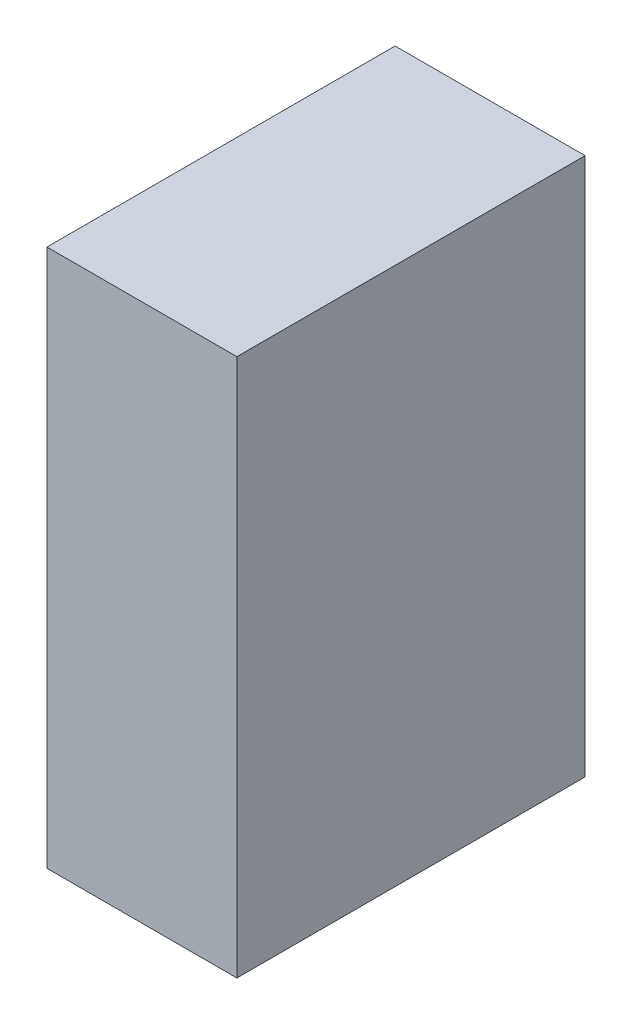
ISO-10303-21;
HEADER;
FILE_DESCRIPTION(('STEP AP214'),'2;1');
FILE_NAME('part.step','',(''),(''),'','','');
FILE_SCHEMA(('AUTOMOTIVE_DESIGN { 1 0 10303 214 1 1 1 1 }'));
ENDSEC;
DATA;
#1=APPLICATION_CONTEXT('core data for automotive mechanical design processes');
#2=APPLICATION_PROTOCOL_DEFINITION('international standard','automotive_design',2000,#1);
#3=PRODUCT_CONTEXT('',#1,'mechanical');
#4=PRODUCT('Part','Part','',(#3));
#5=PRODUCT_RELATED_PRODUCT_CATEGORY('part','',(#4));
#6=PRODUCT_DEFINITION_FORMATION('','',#4);
#7=PRODUCT_DEFINITION_CONTEXT('part definition',#1,'design');
#8=PRODUCT_DEFINITION('design','',#6,#7);
#9=PRODUCT_DEFINITION_SHAPE('','',#8);
#10=(LENGTH_UNIT() NAMED_UNIT(*) SI_UNIT(.MILLI.,.METRE.));
#11=(NAMED_UNIT(*) PLANE_ANGLE_UNIT() SI_UNIT($,.RADIAN.));
#12=(NAMED_UNIT(*) SI_UNIT($,.STERADIAN.) SOLID_ANGLE_UNIT());
#13=UNCERTAINTY_MEASURE_WITH_UNIT(LENGTH_MEASURE(1.E-05),#10,'distance_accuracy_value','');
#14=(GEOMETRIC_REPRESENTATION_CONTEXT(3) GLOBAL_UNCERTAINTY_ASSIGNED_CONTEXT((#13)) GLOBAL_UNIT_ASSIGNED_CONTEXT((#10,
#11,#12)) REPRESENTATION_CONTEXT('',''));
#15=CARTESIAN_POINT('',(0.,0.,0.));
#16=DIRECTION('',(0.,0.,1.));
#17=DIRECTION('',(1.,0.,0.));
#18=AXIS2_PLACEMENT_3D('',#15,#16,#17);
#19=CARTESIAN_POINT('',(0.3,0.,0.));
#20=DIRECTION('',(1.,0.,0.));
#21=DIRECTION('',(0.,0.,-1.));
#22=AXIS2_PLACEMENT_3D('',#19,#20,#21);
#23=PLANE('',#22);
#24=DIRECTION('',(0.,0.,1.));
#25=VECTOR('',#24,1.);
#26=CARTESIAN_POINT('',(0.3,0.85,0.));
#27=LINE('',#26,#25);
#28=CARTESIAN_POINT('',(0.3,0.85,0.55));
#29=VERTEX_POINT('',#28);
#30=CARTESIAN_POINT('',(0.3,0.85,0.));
#31=VERTEX_POINT('',#30);
#32=EDGE_CURVE('E76',#29,#31,#27,.F.);
#33=ORIENTED_EDGE('',*,*,#32,.F.);
#34=DIRECTION('',(0.,1.,0.));
#35=VECTOR('',#34,1.);
#36=CARTESIAN_POINT('',(0.3,0.,0.55));
#37=LINE('',#36,#35);
#38=CARTESIAN_POINT('',(0.3,0.,0.55));
#39=VERTEX_POINT('',#38);
#40=EDGE_CURVE('E58',#39,#29,#37,.T.);
#41=ORIENTED_EDGE('',*,*,#40,.F.);
#42=DIRECTION('',(0.,0.,1.));
#43=VECTOR('',#42,1.);
#44=CARTESIAN_POINT('',(0.3,0.,0.));
#45=LINE('',#44,#43);
#46=CARTESIAN_POINT('',(0.3,0.,0.));
#47=VERTEX_POINT('',#46);
#48=EDGE_CURVE('E20',#39,#47,#45,.F.);
#49=ORIENTED_EDGE('',*,*,#48,.T.);
#50=DIRECTION('',(0.,1.,0.));
#51=VECTOR('',#50,1.);
#52=CARTESIAN_POINT('',(0.3,0.,0.));
#53=LINE('',#52,#51);
#54=EDGE_CURVE('E55',#47,#31,#53,.T.);
#55=ORIENTED_EDGE('',*,*,#54,.T.);
#56=EDGE_LOOP('',(#33,#41,#49,#55));
#57=FACE_BOUND('',#56,.T.);
#58=ADVANCED_FACE('F17',(#57),#23,.T.);
#59=CARTESIAN_POINT('',(0.,0.,0.));
#60=DIRECTION('',(0.,1.,0.));
#61=DIRECTION('',(0.,0.,1.));
#62=AXIS2_PLACEMENT_3D('',#59,#60,#61);
#63=PLANE('',#62);
#64=DIRECTION('',(1.,0.,0.));
#65=VECTOR('',#64,1.);
#66=CARTESIAN_POINT('',(0.,0.,0.55));
#67=LINE('',#66,#65);
#68=CARTESIAN_POINT('',(0.,0.,0.55));
#69=VERTEX_POINT('',#68);
#70=EDGE_CURVE('E78',#69,#39,#67,.T.);
#71=ORIENTED_EDGE('',*,*,#70,.F.);
#72=DIRECTION('',(0.,0.,-1.));
#73=VECTOR('',#72,1.);
#74=CARTESIAN_POINT('',(0.,0.,0.));
#75=LINE('',#74,#73);
#76=CARTESIAN_POINT('',(0.,0.,0.));
#77=VERTEX_POINT('',#76);
#78=EDGE_CURVE('E73',#69,#77,#75,.T.);
#79=ORIENTED_EDGE('',*,*,#78,.T.);
#80=DIRECTION('',(1.,0.,0.));
#81=VECTOR('',#80,1.);
#82=CARTESIAN_POINT('',(0.,0.,0.));
#83=LINE('',#82,#81);
#84=EDGE_CURVE('E63',#77,#47,#83,.T.);
#85=ORIENTED_EDGE('',*,*,#84,.T.);
#86=ORIENTED_EDGE('',*,*,#48,.F.);
#87=EDGE_LOOP('',(#71,#79,#85,#86));
#88=FACE_BOUND('',#87,.T.);
#89=ADVANCED_FACE('F72',(#88),#63,.F.);
#90=CARTESIAN_POINT('',(0.,0.,0.));
#91=DIRECTION('',(0.,0.,1.));
#92=DIRECTION('',(1.,0.,0.));
#93=AXIS2_PLACEMENT_3D('',#90,#91,#92);
#94=PLANE('',#93);
#95=ORIENTED_EDGE('',*,*,#54,.F.);
#96=ORIENTED_EDGE('',*,*,#84,.F.);
#97=DIRECTION('',(0.,1.,0.));
#98=VECTOR('',#97,1.);
#99=CARTESIAN_POINT('',(0.,0.,0.));
#100=LINE('',#99,#98);
#101=CARTESIAN_POINT('',(0.,0.85,0.));
#102=VERTEX_POINT('',#101);
#103=EDGE_CURVE('E83',#77,#102,#100,.T.);
#104=ORIENTED_EDGE('',*,*,#103,.T.);
#105=DIRECTION('',(1.,0.,0.));
#106=VECTOR('',#105,1.);
#107=CARTESIAN_POINT('',(0.,0.85,0.));
#108=LINE('',#107,#106);
#109=EDGE_CURVE('E69',#31,#102,#108,.F.);
#110=ORIENTED_EDGE('',*,*,#109,.F.);
#111=EDGE_LOOP('',(#95,#96,#104,#110));
#112=FACE_BOUND('',#111,.T.);
#113=ADVANCED_FACE('F66',(#112),#94,.F.);
#114=CARTESIAN_POINT('',(0.,0.85,0.));
#115=DIRECTION('',(0.,1.,0.));
#116=DIRECTION('',(0.,0.,1.));
#117=AXIS2_PLACEMENT_3D('',#114,#115,#116);
#118=PLANE('',#117);
#119=DIRECTION('',(1.,0.,0.));
#120=VECTOR('',#119,1.);
#121=CARTESIAN_POINT('',(0.,0.85,0.55));
#122=LINE('',#121,#120);
#123=CARTESIAN_POINT('',(0.,0.85,0.55));
#124=VERTEX_POINT('',#123);
#125=EDGE_CURVE('E34',#29,#124,#122,.F.);
#126=ORIENTED_EDGE('',*,*,#125,.F.);
#127=ORIENTED_EDGE('',*,*,#32,.T.);
#128=ORIENTED_EDGE('',*,*,#109,.T.);
#129=DIRECTION('',(0.,0.,-1.));
#130=VECTOR('',#129,1.);
#131=CARTESIAN_POINT('',(0.,0.85,0.));
#132=LINE('',#131,#130);
#133=EDGE_CURVE('E26',#102,#124,#132,.F.);
#134=ORIENTED_EDGE('',*,*,#133,.T.);
#135=EDGE_LOOP('',(#126,#127,#128,#134));
#136=FACE_BOUND('',#135,.T.);
#137=ADVANCED_FACE('F88',(#136),#118,.T.);
#138=CARTESIAN_POINT('',(0.,0.,0.55));
#139=DIRECTION('',(0.,0.,1.));
#140=DIRECTION('',(1.,0.,0.));
#141=AXIS2_PLACEMENT_3D('',#138,#139,#140);
#142=PLANE('',#141);
#143=ORIENTED_EDGE('',*,*,#40,.T.);
#144=ORIENTED_EDGE('',*,*,#125,.T.);
#145=DIRECTION('',(0.,1.,0.));
#146=VECTOR('',#145,1.);
#147=CARTESIAN_POINT('',(0.,0.,0.55));
#148=LINE('',#147,#146);
#149=EDGE_CURVE('E11',#124,#69,#148,.F.);
#150=ORIENTED_EDGE('',*,*,#149,.T.);
#151=ORIENTED_EDGE('',*,*,#70,.T.);
#152=EDGE_LOOP('',(#143,#144,#150,#151));
#153=FACE_BOUND('',#152,.T.);
#154=ADVANCED_FACE('F91',(#153),#142,.T.);
#155=CARTESIAN_POINT('',(0.,0.,0.));
#156=DIRECTION('',(1.,0.,0.));
#157=DIRECTION('',(0.,0.,-1.));
#158=AXIS2_PLACEMENT_3D('',#155,#156,#157);
#159=PLANE('',#158);
#160=ORIENTED_EDGE('',*,*,#133,.F.);
#161=ORIENTED_EDGE('',*,*,#103,.F.);
#162=ORIENTED_EDGE('',*,*,#78,.F.);
#163=ORIENTED_EDGE('',*,*,#149,.F.);
#164=EDGE_LOOP('',(#160,#161,#162,#163));
#165=FACE_BOUND('',#164,.T.);
#166=ADVANCED_FACE('F90',(#165),#159,.F.);
#167=CLOSED_SHELL('',(#58,#89,#113,#137,#154,#166));
#168=MANIFOLD_SOLID_BREP('B1',#167);
#169=ADVANCED_BREP_SHAPE_REPRESENTATION('',(#18,#168),#14);
#170=SHAPE_DEFINITION_REPRESENTATION(#9,#169);
ENDSEC;
END-ISO-10303-21;
